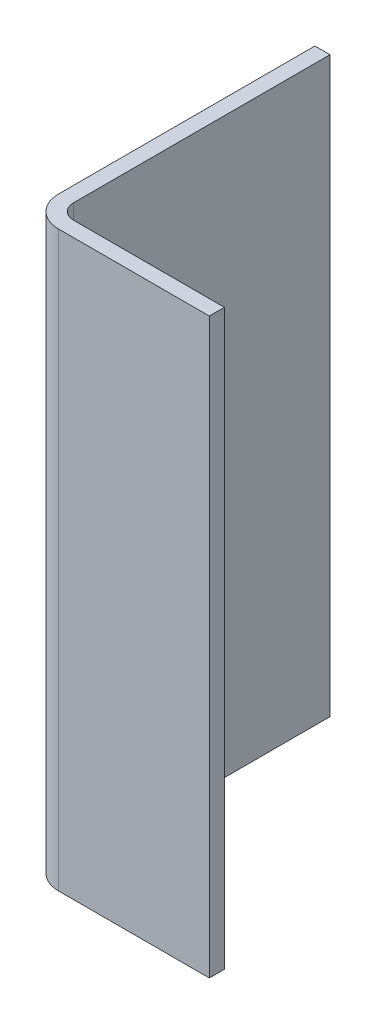
ISO-10303-21;
HEADER;
FILE_DESCRIPTION(('STEP AP214'),'2;1');
FILE_NAME('part.step','',(''),(''),'','','');
FILE_SCHEMA(('AUTOMOTIVE_DESIGN { 1 0 10303 214 1 1 1 1 }'));
ENDSEC;
DATA;
#1=APPLICATION_CONTEXT('core data for automotive mechanical design processes');
#2=APPLICATION_PROTOCOL_DEFINITION('international standard','automotive_design',2000,#1);
#3=PRODUCT_CONTEXT('',#1,'mechanical');
#4=PRODUCT('Part','Part','',(#3));
#5=PRODUCT_RELATED_PRODUCT_CATEGORY('part','',(#4));
#6=PRODUCT_DEFINITION_FORMATION('','',#4);
#7=PRODUCT_DEFINITION_CONTEXT('part definition',#1,'design');
#8=PRODUCT_DEFINITION('design','',#6,#7);
#9=PRODUCT_DEFINITION_SHAPE('','',#8);
#10=(LENGTH_UNIT() NAMED_UNIT(*) SI_UNIT(.MILLI.,.METRE.));
#11=(NAMED_UNIT(*) PLANE_ANGLE_UNIT() SI_UNIT($,.RADIAN.));
#12=(NAMED_UNIT(*) SI_UNIT($,.STERADIAN.) SOLID_ANGLE_UNIT());
#13=UNCERTAINTY_MEASURE_WITH_UNIT(LENGTH_MEASURE(1.E-05),#10,'distance_accuracy_value','');
#14=(GEOMETRIC_REPRESENTATION_CONTEXT(3) GLOBAL_UNCERTAINTY_ASSIGNED_CONTEXT((#13)) GLOBAL_UNIT_ASSIGNED_CONTEXT((#10,
#11,#12)) REPRESENTATION_CONTEXT('',''));
#15=CARTESIAN_POINT('',(0.,0.,0.));
#16=DIRECTION('',(0.,0.,1.));
#17=DIRECTION('',(1.,0.,0.));
#18=AXIS2_PLACEMENT_3D('',#15,#16,#17);
#19=CARTESIAN_POINT('',(23.646,38.989,0.));
#20=DIRECTION('',(0.,-2.05103306050651E-10,1.));
#21=DIRECTION('',(0.,-1.,-2.05103306050651E-10));
#22=AXIS2_PLACEMENT_3D('',#19,#20,#21);
#23=PLANE('',#22);
#24=DIRECTION('',(0.,1.,2.05103306050651E-10));
#25=VECTOR('',#24,1.);
#26=CARTESIAN_POINT('',(23.646,39.539,1.12806804370737E-10));
#27=LINE('',#26,#25);
#28=CARTESIAN_POINT('',(23.646,38.039,-1.94848143271952E-10));
#29=VERTEX_POINT('',#28);
#30=CARTESIAN_POINT('',(23.646,39.939,1.94848132040962E-10));
#31=VERTEX_POINT('',#30);
#32=EDGE_CURVE('E84',#29,#31,#27,.T.);
#33=ORIENTED_EDGE('',*,*,#32,.F.);
#34=DIRECTION('',(1.,0.,0.));
#35=VECTOR('',#34,1.);
#36=CARTESIAN_POINT('',(23.646,38.039,-1.94848140748117E-10));
#37=LINE('',#36,#35);
#38=CARTESIAN_POINT('',(24.146,38.0390000000046,-1.94848140748118E-10));
#39=VERTEX_POINT('',#38);
#40=EDGE_CURVE('E90',#29,#39,#37,.T.);
#41=ORIENTED_EDGE('',*,*,#40,.T.);
#42=DIRECTION('',(0.,1.,0.));
#43=VECTOR('',#42,1.);
#44=CARTESIAN_POINT('',(24.146,38.989,-1.94848140748119E-10));
#45=LINE('',#44,#43);
#46=CARTESIAN_POINT('',(24.146,39.939,-6.49493802493727E-11));
#47=VERTEX_POINT('',#46);
#48=EDGE_CURVE('E87',#39,#47,#45,.T.);
#49=ORIENTED_EDGE('',*,*,#48,.T.);
#50=DIRECTION('',(1.,0.,0.));
#51=VECTOR('',#50,1.);
#52=CARTESIAN_POINT('',(23.646,39.939,1.9484814074812E-10));
#53=LINE('',#52,#51);
#54=EDGE_CURVE('E80',#47,#31,#53,.F.);
#55=ORIENTED_EDGE('',*,*,#54,.T.);
#56=EDGE_LOOP('',(#33,#41,#49,#55));
#57=FACE_BOUND('',#56,.T.);
#58=ADVANCED_FACE('F17',(#57),#23,.T.);
#59=CARTESIAN_POINT('',(24.146,38.989,0.));
#60=DIRECTION('',(-1.,0.,0.));
#61=DIRECTION('',(0.,0.,1.));
#62=AXIS2_PLACEMENT_3D('',#59,#60,#61);
#63=PLANE('',#62);
#64=DIRECTION('',(0.,0.,1.));
#65=VECTOR('',#64,1.);
#66=CARTESIAN_POINT('',(24.146,38.0390000000103,0.));
#67=LINE('',#66,#65);
#68=CARTESIAN_POINT('',(24.146,38.0390000000103,-0.0500000000649494));
#69=VERTEX_POINT('',#68);
#70=EDGE_CURVE('E102',#69,#39,#67,.T.);
#71=ORIENTED_EDGE('',*,*,#70,.F.);
#72=DIRECTION('',(0.,1.,2.05103306050651E-10));
#73=VECTOR('',#72,1.);
#74=CARTESIAN_POINT('',(24.146,40.0890000000103,-0.0499999997743864));
#75=LINE('',#74,#73);
#76=CARTESIAN_POINT('',(24.146,39.9390000000069,-0.0499999998051519));
#77=VERTEX_POINT('',#76);
#78=EDGE_CURVE('E124',#77,#69,#75,.F.);
#79=ORIENTED_EDGE('',*,*,#78,.F.);
#80=DIRECTION('',(0.,0.,1.));
#81=VECTOR('',#80,1.);
#82=CARTESIAN_POINT('',(24.146,39.939,0.));
#83=LINE('',#82,#81);
#84=EDGE_CURVE('E109',#47,#77,#83,.F.);
#85=ORIENTED_EDGE('',*,*,#84,.F.);
#86=ORIENTED_EDGE('',*,*,#48,.F.);
#87=EDGE_LOOP('',(#71,#79,#85,#86));
#88=FACE_BOUND('',#87,.T.);
#89=ADVANCED_FACE('F146',(#88),#63,.F.);
#90=CARTESIAN_POINT('',(23.646,39.5390000000205,-0.0999999998871932));
#91=DIRECTION('',(0.,1.,2.05103306050651E-10));
#92=DIRECTION('',(0.,-2.05103306050651E-10,1.));
#93=AXIS2_PLACEMENT_3D('',#90,#91,#92);
#94=CYLINDRICAL_SURFACE('',#93,0.1);
#95=DIRECTION('',(0.,1.,0.));
#96=VECTOR('',#95,1.);
#97=CARTESIAN_POINT('',(23.546,38.9890000001948,-0.100000000194848));
#98=LINE('',#97,#96);
#99=CARTESIAN_POINT('',(23.546,38.0390000000205,-0.100000000194848));
#100=VERTEX_POINT('',#99);
#101=CARTESIAN_POINT('',(23.546,39.9390000000205,-0.0999999999999999));
#102=VERTEX_POINT('',#101);
#103=EDGE_CURVE('E149',#100,#102,#98,.T.);
#104=ORIENTED_EDGE('',*,*,#103,.F.);
#105=CARTESIAN_POINT('',(23.646,38.0390000000205,-0.100000000194848));
#106=DIRECTION('',(0.,1.,2.05103306050651E-10));
#107=DIRECTION('',(0.,-2.05103306050651E-10,1.));
#108=AXIS2_PLACEMENT_3D('',#105,#106,#107);
#109=CIRCLE('',#108,0.1);
#110=EDGE_CURVE('E99',#100,#29,#109,.T.);
#111=ORIENTED_EDGE('',*,*,#110,.T.);
#112=ORIENTED_EDGE('',*,*,#32,.T.);
#113=CARTESIAN_POINT('',(23.646,39.9390000000205,-0.0999999998051519));
#114=DIRECTION('',(0.,1.,2.05103306050651E-10));
#115=DIRECTION('',(0.,-2.05103306050651E-10,1.));
#116=AXIS2_PLACEMENT_3D('',#113,#114,#115);
#117=CIRCLE('',#116,0.1);
#118=EDGE_CURVE('E20',#31,#102,#117,.F.);
#119=ORIENTED_EDGE('',*,*,#118,.T.);
#120=EDGE_LOOP('',(#104,#111,#112,#119));
#121=FACE_BOUND('',#120,.T.);
#122=ADVANCED_FACE('F100',(#121),#94,.T.);
#123=CARTESIAN_POINT('',(23.646,40.0890000000103,-0.0499999997743864));
#124=DIRECTION('',(0.,2.05103306050651E-10,-1.));
#125=DIRECTION('',(0.,1.,2.05103306050651E-10));
#126=AXIS2_PLACEMENT_3D('',#123,#124,#125);
#127=PLANE('',#126);
#128=DIRECTION('',(0.,1.,2.05103306050651E-10));
#129=VECTOR('',#128,1.);
#130=CARTESIAN_POINT('',(23.646,38.9890000000103,-0.0500000000000001));
#131=LINE('',#130,#129);
#132=CARTESIAN_POINT('',(23.646,38.0390000000103,-0.0500000001948482));
#133=VERTEX_POINT('',#132);
#134=CARTESIAN_POINT('',(23.646,39.9390000000103,-0.0499999998051519));
#135=VERTEX_POINT('',#134);
#136=EDGE_CURVE('E151',#133,#135,#131,.T.);
#137=ORIENTED_EDGE('',*,*,#136,.T.);
#138=DIRECTION('',(1.,0.,0.));
#139=VECTOR('',#138,1.);
#140=CARTESIAN_POINT('',(23.646,39.9390000000103,-0.0499999998051519));
#141=LINE('',#140,#139);
#142=EDGE_CURVE('E131',#135,#77,#141,.T.);
#143=ORIENTED_EDGE('',*,*,#142,.T.);
#144=ORIENTED_EDGE('',*,*,#78,.T.);
#145=DIRECTION('',(1.,0.,0.));
#146=VECTOR('',#145,1.);
#147=CARTESIAN_POINT('',(23.646,38.0390000000103,-0.0500000001948482));
#148=LINE('',#147,#146);
#149=EDGE_CURVE('E126',#69,#133,#148,.F.);
#150=ORIENTED_EDGE('',*,*,#149,.T.);
#151=EDGE_LOOP('',(#137,#143,#144,#150));
#152=FACE_BOUND('',#151,.T.);
#153=ADVANCED_FACE('F152',(#152),#127,.T.);
#154=CARTESIAN_POINT('',(23.546,38.9890000001948,-0.95));
#155=DIRECTION('',(-1.,0.,0.));
#156=DIRECTION('',(0.,0.,1.));
#157=AXIS2_PLACEMENT_3D('',#154,#155,#156);
#158=PLANE('',#157);
#159=DIRECTION('',(0.,1.,2.05103306050651E-10));
#160=VECTOR('',#159,1.);
#161=CARTESIAN_POINT('',(23.546,38.9890000001948,-0.95));
#162=LINE('',#161,#160);
#163=CARTESIAN_POINT('',(23.546,38.0390000001948,-0.950000000194848));
#164=VERTEX_POINT('',#163);
#165=CARTESIAN_POINT('',(23.546,39.9390000001367,-0.949999999805152));
#166=VERTEX_POINT('',#165);
#167=EDGE_CURVE('E122',#164,#166,#162,.T.);
#168=ORIENTED_EDGE('',*,*,#167,.F.);
#169=DIRECTION('',(0.,2.05103306050651E-10,-1.));
#170=VECTOR('',#169,1.);
#171=CARTESIAN_POINT('',(23.546,38.0390000001948,-0.950000000194848));
#172=LINE('',#171,#170);
#173=EDGE_CURVE('E123',#100,#164,#172,.T.);
#174=ORIENTED_EDGE('',*,*,#173,.F.);
#175=ORIENTED_EDGE('',*,*,#103,.T.);
#176=DIRECTION('',(0.,0.,1.));
#177=VECTOR('',#176,1.);
#178=CARTESIAN_POINT('',(23.546,39.9390000000205,-0.95));
#179=LINE('',#178,#177);
#180=EDGE_CURVE('E95',#102,#166,#179,.F.);
#181=ORIENTED_EDGE('',*,*,#180,.T.);
#182=EDGE_LOOP('',(#168,#174,#175,#181));
#183=FACE_BOUND('',#182,.T.);
#184=ADVANCED_FACE('F193',(#183),#158,.T.);
#185=CARTESIAN_POINT('',(23.646,38.9890000000205,-0.1));
#186=DIRECTION('',(0.,1.,2.05103306050651E-10));
#187=DIRECTION('',(0.,-2.05103306050651E-10,1.));
#188=AXIS2_PLACEMENT_3D('',#185,#186,#187);
#189=CYLINDRICAL_SURFACE('',#188,0.0499999999999999);
#190=CARTESIAN_POINT('',(23.646,39.9390000000206,-0.0999999998051519));
#191=DIRECTION('',(0.,1.,2.05103306050651E-10));
#192=DIRECTION('',(0.,-2.05103306050651E-10,1.));
#193=AXIS2_PLACEMENT_3D('',#190,#191,#192);
#194=CIRCLE('',#193,0.0499999999999999);
#195=CARTESIAN_POINT('',(23.596,39.9390000001077,-0.0999999998051519));
#196=VERTEX_POINT('',#195);
#197=EDGE_CURVE('E116',#135,#196,#194,.F.);
#198=ORIENTED_EDGE('',*,*,#197,.F.);
#199=ORIENTED_EDGE('',*,*,#136,.F.);
#200=CARTESIAN_POINT('',(23.646,38.0390000000205,-0.100000000194848));
#201=DIRECTION('',(0.,1.,2.05103306050651E-10));
#202=DIRECTION('',(0.,-2.05103306050651E-10,1.));
#203=AXIS2_PLACEMENT_3D('',#200,#201,#202);
#204=CIRCLE('',#203,0.0499999999999999);
#205=CARTESIAN_POINT('',(23.596,38.0390000000205,-0.1));
#206=VERTEX_POINT('',#205);
#207=EDGE_CURVE('E120',#206,#133,#204,.T.);
#208=ORIENTED_EDGE('',*,*,#207,.F.);
#209=DIRECTION('',(0.,1.,0.));
#210=VECTOR('',#209,1.);
#211=CARTESIAN_POINT('',(23.596,40.0890000001948,-0.0999999998051519));
#212=LINE('',#211,#210);
#213=EDGE_CURVE('E157',#196,#206,#212,.F.);
#214=ORIENTED_EDGE('',*,*,#213,.F.);
#215=EDGE_LOOP('',(#198,#199,#208,#214));
#216=FACE_BOUND('',#215,.T.);
#217=ADVANCED_FACE('F155',(#216),#189,.F.);
#218=CARTESIAN_POINT('',(23.596,38.0390000001948,-0.950000000194848));
#219=DIRECTION('',(0.,-1.,-2.05103306050651E-10));
#220=DIRECTION('',(0.,2.05103306050651E-10,-1.));
#221=AXIS2_PLACEMENT_3D('',#218,#219,#220);
#222=PLANE('',#221);
#223=DIRECTION('',(0.,0.,-1.));
#224=VECTOR('',#223,1.);
#225=CARTESIAN_POINT('',(23.596,38.0390000000205,-0.949999999774386));
#226=LINE('',#225,#224);
#227=CARTESIAN_POINT('',(23.596,38.0390000000786,-0.950000000194848));
#228=VERTEX_POINT('',#227);
#229=EDGE_CURVE('E160',#206,#228,#226,.T.);
#230=ORIENTED_EDGE('',*,*,#229,.F.);
#231=ORIENTED_EDGE('',*,*,#207,.T.);
#232=ORIENTED_EDGE('',*,*,#149,.F.);
#233=ORIENTED_EDGE('',*,*,#70,.T.);
#234=ORIENTED_EDGE('',*,*,#40,.F.);
#235=ORIENTED_EDGE('',*,*,#110,.F.);
#236=ORIENTED_EDGE('',*,*,#173,.T.);
#237=DIRECTION('',(1.,0.,0.));
#238=VECTOR('',#237,1.);
#239=CARTESIAN_POINT('',(23.571,38.0390000001948,-0.950000000194848));
#240=LINE('',#239,#238);
#241=EDGE_CURVE('E119',#228,#164,#240,.F.);
#242=ORIENTED_EDGE('',*,*,#241,.F.);
#243=EDGE_LOOP('',(#230,#231,#232,#233,#234,#235,#236,#242));
#244=FACE_BOUND('',#243,.T.);
#245=ADVANCED_FACE('F144',(#244),#222,.T.);
#246=CARTESIAN_POINT('',(23.571,38.9890000001948,-0.95));
#247=DIRECTION('',(0.,2.05103306050651E-10,-1.));
#248=DIRECTION('',(0.,1.,2.05103306050651E-10));
#249=AXIS2_PLACEMENT_3D('',#246,#247,#248);
#250=PLANE('',#249);
#251=DIRECTION('',(0.,1.,0.));
#252=VECTOR('',#251,1.);
#253=CARTESIAN_POINT('',(23.596,40.0890000001948,-0.950000000194848));
#254=LINE('',#253,#252);
#255=CARTESIAN_POINT('',(23.596,39.9390000001948,-0.95));
#256=VERTEX_POINT('',#255);
#257=EDGE_CURVE('E26',#228,#256,#254,.T.);
#258=ORIENTED_EDGE('',*,*,#257,.F.);
#259=ORIENTED_EDGE('',*,*,#241,.T.);
#260=ORIENTED_EDGE('',*,*,#167,.T.);
#261=DIRECTION('',(1.,0.,0.));
#262=VECTOR('',#261,1.);
#263=CARTESIAN_POINT('',(23.546,39.9390000001948,-0.949999999805152));
#264=LINE('',#263,#262);
#265=EDGE_CURVE('E35',#256,#166,#264,.F.);
#266=ORIENTED_EDGE('',*,*,#265,.F.);
#267=EDGE_LOOP('',(#258,#259,#260,#266));
#268=FACE_BOUND('',#267,.T.);
#269=ADVANCED_FACE('F194',(#268),#250,.T.);
#270=CARTESIAN_POINT('',(23.546,39.9390000001948,-0.949999999805152));
#271=DIRECTION('',(0.,1.,2.05103306050651E-10));
#272=DIRECTION('',(0.,-2.05103306050651E-10,1.));
#273=AXIS2_PLACEMENT_3D('',#270,#271,#272);
#274=PLANE('',#273);
#275=ORIENTED_EDGE('',*,*,#180,.F.);
#276=ORIENTED_EDGE('',*,*,#118,.F.);
#277=ORIENTED_EDGE('',*,*,#54,.F.);
#278=ORIENTED_EDGE('',*,*,#84,.T.);
#279=ORIENTED_EDGE('',*,*,#142,.F.);
#280=ORIENTED_EDGE('',*,*,#197,.T.);
#281=DIRECTION('',(0.,0.,-1.));
#282=VECTOR('',#281,1.);
#283=CARTESIAN_POINT('',(23.596,39.9390000001948,-0.949999999774386));
#284=LINE('',#283,#282);
#285=EDGE_CURVE('E11',#256,#196,#284,.F.);
#286=ORIENTED_EDGE('',*,*,#285,.F.);
#287=ORIENTED_EDGE('',*,*,#265,.T.);
#288=EDGE_LOOP('',(#275,#276,#277,#278,#279,#280,#286,#287));
#289=FACE_BOUND('',#288,.T.);
#290=ADVANCED_FACE('F94',(#289),#274,.T.);
#291=CARTESIAN_POINT('',(23.596,40.0890000001948,-0.949999999774386));
#292=DIRECTION('',(1.,0.,0.));
#293=DIRECTION('',(0.,0.,-1.));
#294=AXIS2_PLACEMENT_3D('',#291,#292,#293);
#295=PLANE('',#294);
#296=ORIENTED_EDGE('',*,*,#257,.T.);
#297=ORIENTED_EDGE('',*,*,#285,.T.);
#298=ORIENTED_EDGE('',*,*,#213,.T.);
#299=ORIENTED_EDGE('',*,*,#229,.T.);
#300=EDGE_LOOP('',(#296,#297,#298,#299));
#301=FACE_BOUND('',#300,.T.);
#302=ADVANCED_FACE('F195',(#301),#295,.T.);
#303=CLOSED_SHELL('',(#58,#89,#122,#153,#184,#217,#245,#269,#290,#302));
#304=MANIFOLD_SOLID_BREP('B1',#303);
#305=ADVANCED_BREP_SHAPE_REPRESENTATION('',(#18,#304),#14);
#306=SHAPE_DEFINITION_REPRESENTATION(#9,#305);
ENDSEC;
END-ISO-10303-21;
